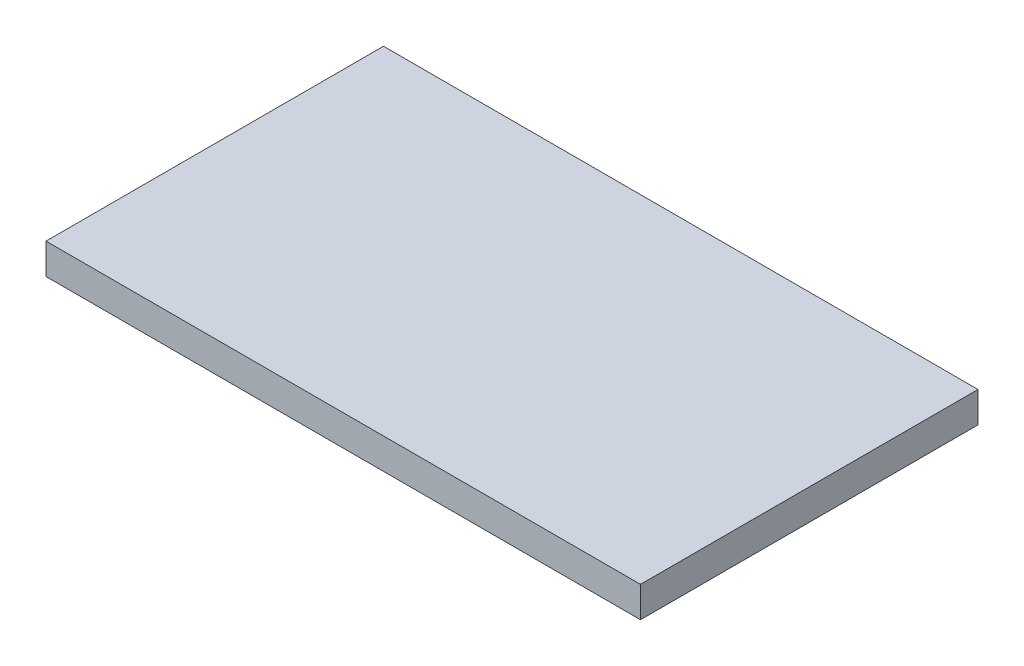
ISO-10303-21;
HEADER;
FILE_DESCRIPTION(('STEP AP214'),'2;1');
FILE_NAME('part.step','',(''),(''),'','','');
FILE_SCHEMA(('AUTOMOTIVE_DESIGN { 1 0 10303 214 1 1 1 1 }'));
ENDSEC;
DATA;
#1=APPLICATION_CONTEXT('core data for automotive mechanical design processes');
#2=APPLICATION_PROTOCOL_DEFINITION('international standard','automotive_design',2000,#1);
#3=PRODUCT_CONTEXT('',#1,'mechanical');
#4=PRODUCT('Part','Part','',(#3));
#5=PRODUCT_RELATED_PRODUCT_CATEGORY('part','',(#4));
#6=PRODUCT_DEFINITION_FORMATION('','',#4);
#7=PRODUCT_DEFINITION_CONTEXT('part definition',#1,'design');
#8=PRODUCT_DEFINITION('design','',#6,#7);
#9=PRODUCT_DEFINITION_SHAPE('','',#8);
#10=(LENGTH_UNIT() NAMED_UNIT(*) SI_UNIT(.MILLI.,.METRE.));
#11=(NAMED_UNIT(*) PLANE_ANGLE_UNIT() SI_UNIT($,.RADIAN.));
#12=(NAMED_UNIT(*) SI_UNIT($,.STERADIAN.) SOLID_ANGLE_UNIT());
#13=UNCERTAINTY_MEASURE_WITH_UNIT(LENGTH_MEASURE(1.E-05),#10,'distance_accuracy_value','');
#14=(GEOMETRIC_REPRESENTATION_CONTEXT(3) GLOBAL_UNCERTAINTY_ASSIGNED_CONTEXT((#13)) GLOBAL_UNIT_ASSIGNED_CONTEXT((#10,
#11,#12)) REPRESENTATION_CONTEXT('',''));
#15=CARTESIAN_POINT('',(0.,0.,0.));
#16=DIRECTION('',(0.,0.,1.));
#17=DIRECTION('',(1.,0.,0.));
#18=AXIS2_PLACEMENT_3D('',#15,#16,#17);
#19=CARTESIAN_POINT('',(-15.5,1.6,8.8));
#20=DIRECTION('',(1.,0.,0.));
#21=DIRECTION('',(0.,0.,-1.));
#22=AXIS2_PLACEMENT_3D('',#19,#20,#21);
#23=PLANE('',#22);
#24=DIRECTION('',(0.,0.,1.));
#25=VECTOR('',#24,1.);
#26=CARTESIAN_POINT('',(-15.5,0.,8.8));
#27=LINE('',#26,#25);
#28=CARTESIAN_POINT('',(-15.5,0.,-8.8));
#29=VERTEX_POINT('',#28);
#30=CARTESIAN_POINT('',(-15.5,0.,8.8));
#31=VERTEX_POINT('',#30);
#32=EDGE_CURVE('E97',#29,#31,#27,.T.);
#33=ORIENTED_EDGE('',*,*,#32,.T.);
#34=DIRECTION('',(0.,-1.,0.));
#35=VECTOR('',#34,1.);
#36=CARTESIAN_POINT('',(-15.5,1.6,8.8));
#37=LINE('',#36,#35);
#38=CARTESIAN_POINT('',(-15.5,1.6,8.8));
#39=VERTEX_POINT('',#38);
#40=EDGE_CURVE('E50',#39,#31,#37,.T.);
#41=ORIENTED_EDGE('',*,*,#40,.F.);
#42=DIRECTION('',(0.,0.,1.));
#43=VECTOR('',#42,1.);
#44=CARTESIAN_POINT('',(-15.5,1.6,8.8));
#45=LINE('',#44,#43);
#46=CARTESIAN_POINT('',(-15.5,1.6,-8.8));
#47=VERTEX_POINT('',#46);
#48=EDGE_CURVE('E89',#47,#39,#45,.T.);
#49=ORIENTED_EDGE('',*,*,#48,.F.);
#50=DIRECTION('',(0.,-1.,0.));
#51=VECTOR('',#50,1.);
#52=CARTESIAN_POINT('',(-15.5,1.6,-8.8));
#53=LINE('',#52,#51);
#54=EDGE_CURVE('E11',#47,#29,#53,.T.);
#55=ORIENTED_EDGE('',*,*,#54,.T.);
#56=EDGE_LOOP('',(#33,#41,#49,#55));
#57=FACE_BOUND('',#56,.T.);
#58=ADVANCED_FACE('F41',(#57),#23,.F.);
#59=CARTESIAN_POINT('',(15.5,1.6,8.8));
#60=DIRECTION('',(0.,0.,-1.));
#61=DIRECTION('',(-1.,0.,0.));
#62=AXIS2_PLACEMENT_3D('',#59,#60,#61);
#63=PLANE('',#62);
#64=DIRECTION('',(1.,0.,0.));
#65=VECTOR('',#64,1.);
#66=CARTESIAN_POINT('',(15.5,0.,8.8));
#67=LINE('',#66,#65);
#68=CARTESIAN_POINT('',(15.5,0.,8.8));
#69=VERTEX_POINT('',#68);
#70=EDGE_CURVE('E76',#31,#69,#67,.T.);
#71=ORIENTED_EDGE('',*,*,#70,.T.);
#72=DIRECTION('',(0.,-1.,0.));
#73=VECTOR('',#72,1.);
#74=CARTESIAN_POINT('',(15.5,1.6,8.8));
#75=LINE('',#74,#73);
#76=CARTESIAN_POINT('',(15.5,1.6,8.8));
#77=VERTEX_POINT('',#76);
#78=EDGE_CURVE('E99',#77,#69,#75,.T.);
#79=ORIENTED_EDGE('',*,*,#78,.F.);
#80=DIRECTION('',(1.,0.,0.));
#81=VECTOR('',#80,1.);
#82=CARTESIAN_POINT('',(15.5,1.6,8.8));
#83=LINE('',#82,#81);
#84=EDGE_CURVE('E93',#39,#77,#83,.T.);
#85=ORIENTED_EDGE('',*,*,#84,.F.);
#86=ORIENTED_EDGE('',*,*,#40,.T.);
#87=EDGE_LOOP('',(#71,#79,#85,#86));
#88=FACE_BOUND('',#87,.T.);
#89=ADVANCED_FACE('F100',(#88),#63,.F.);
#90=CARTESIAN_POINT('',(15.5,1.6,-8.8));
#91=DIRECTION('',(-1.,0.,0.));
#92=DIRECTION('',(0.,0.,1.));
#93=AXIS2_PLACEMENT_3D('',#90,#91,#92);
#94=PLANE('',#93);
#95=DIRECTION('',(0.,0.,-1.));
#96=VECTOR('',#95,1.);
#97=CARTESIAN_POINT('',(15.5,0.,-8.8));
#98=LINE('',#97,#96);
#99=CARTESIAN_POINT('',(15.5,0.,-8.8));
#100=VERTEX_POINT('',#99);
#101=EDGE_CURVE('E83',#69,#100,#98,.T.);
#102=ORIENTED_EDGE('',*,*,#101,.T.);
#103=DIRECTION('',(0.,-1.,0.));
#104=VECTOR('',#103,1.);
#105=CARTESIAN_POINT('',(15.5,1.6,-8.8));
#106=LINE('',#105,#104);
#107=CARTESIAN_POINT('',(15.5,1.6,-8.8));
#108=VERTEX_POINT('',#107);
#109=EDGE_CURVE('E106',#108,#100,#106,.T.);
#110=ORIENTED_EDGE('',*,*,#109,.F.);
#111=DIRECTION('',(0.,0.,-1.));
#112=VECTOR('',#111,1.);
#113=CARTESIAN_POINT('',(15.5,1.6,-8.8));
#114=LINE('',#113,#112);
#115=EDGE_CURVE('E103',#77,#108,#114,.T.);
#116=ORIENTED_EDGE('',*,*,#115,.F.);
#117=ORIENTED_EDGE('',*,*,#78,.T.);
#118=EDGE_LOOP('',(#102,#110,#116,#117));
#119=FACE_BOUND('',#118,.T.);
#120=ADVANCED_FACE('F122',(#119),#94,.F.);
#121=CARTESIAN_POINT('',(0.,1.6,-8.8));
#122=DIRECTION('',(0.,0.,1.));
#123=DIRECTION('',(1.,0.,0.));
#124=AXIS2_PLACEMENT_3D('',#121,#122,#123);
#125=PLANE('',#124);
#126=DIRECTION('',(-1.,0.,0.));
#127=VECTOR('',#126,1.);
#128=CARTESIAN_POINT('',(0.,0.,-8.8));
#129=LINE('',#128,#127);
#130=EDGE_CURVE('E116',#100,#29,#129,.T.);
#131=ORIENTED_EDGE('',*,*,#130,.T.);
#132=ORIENTED_EDGE('',*,*,#54,.F.);
#133=DIRECTION('',(-1.,0.,0.));
#134=VECTOR('',#133,1.);
#135=CARTESIAN_POINT('',(-15.5,1.6,-8.8));
#136=LINE('',#135,#134);
#137=EDGE_CURVE('E58',#108,#47,#136,.T.);
#138=ORIENTED_EDGE('',*,*,#137,.F.);
#139=ORIENTED_EDGE('',*,*,#109,.T.);
#140=EDGE_LOOP('',(#131,#132,#138,#139));
#141=FACE_BOUND('',#140,.T.);
#142=ADVANCED_FACE('F126',(#141),#125,.F.);
#143=CARTESIAN_POINT('',(0.,1.6,0.));
#144=DIRECTION('',(0.,-1.,0.));
#145=DIRECTION('',(0.,0.,-1.));
#146=AXIS2_PLACEMENT_3D('',#143,#144,#145);
#147=PLANE('',#146);
#148=ORIENTED_EDGE('',*,*,#137,.T.);
#149=ORIENTED_EDGE('',*,*,#48,.T.);
#150=ORIENTED_EDGE('',*,*,#84,.T.);
#151=ORIENTED_EDGE('',*,*,#115,.T.);
#152=EDGE_LOOP('',(#148,#149,#150,#151));
#153=FACE_BOUND('',#152,.T.);
#154=ADVANCED_FACE('F91',(#153),#147,.F.);
#155=CARTESIAN_POINT('',(0.,0.,0.));
#156=DIRECTION('',(0.,-1.,0.));
#157=DIRECTION('',(0.,0.,-1.));
#158=AXIS2_PLACEMENT_3D('',#155,#156,#157);
#159=PLANE('',#158);
#160=ORIENTED_EDGE('',*,*,#32,.F.);
#161=ORIENTED_EDGE('',*,*,#130,.F.);
#162=ORIENTED_EDGE('',*,*,#101,.F.);
#163=ORIENTED_EDGE('',*,*,#70,.F.);
#164=EDGE_LOOP('',(#160,#161,#162,#163));
#165=FACE_BOUND('',#164,.T.);
#166=ADVANCED_FACE('F125',(#165),#159,.T.);
#167=CLOSED_SHELL('',(#58,#89,#120,#142,#154,#166));
#168=MANIFOLD_SOLID_BREP('B2',#167);
#169=ADVANCED_BREP_SHAPE_REPRESENTATION('',(#18,#168),#14);
#170=SHAPE_DEFINITION_REPRESENTATION(#9,#169);
ENDSEC;
END-ISO-10303-21;
